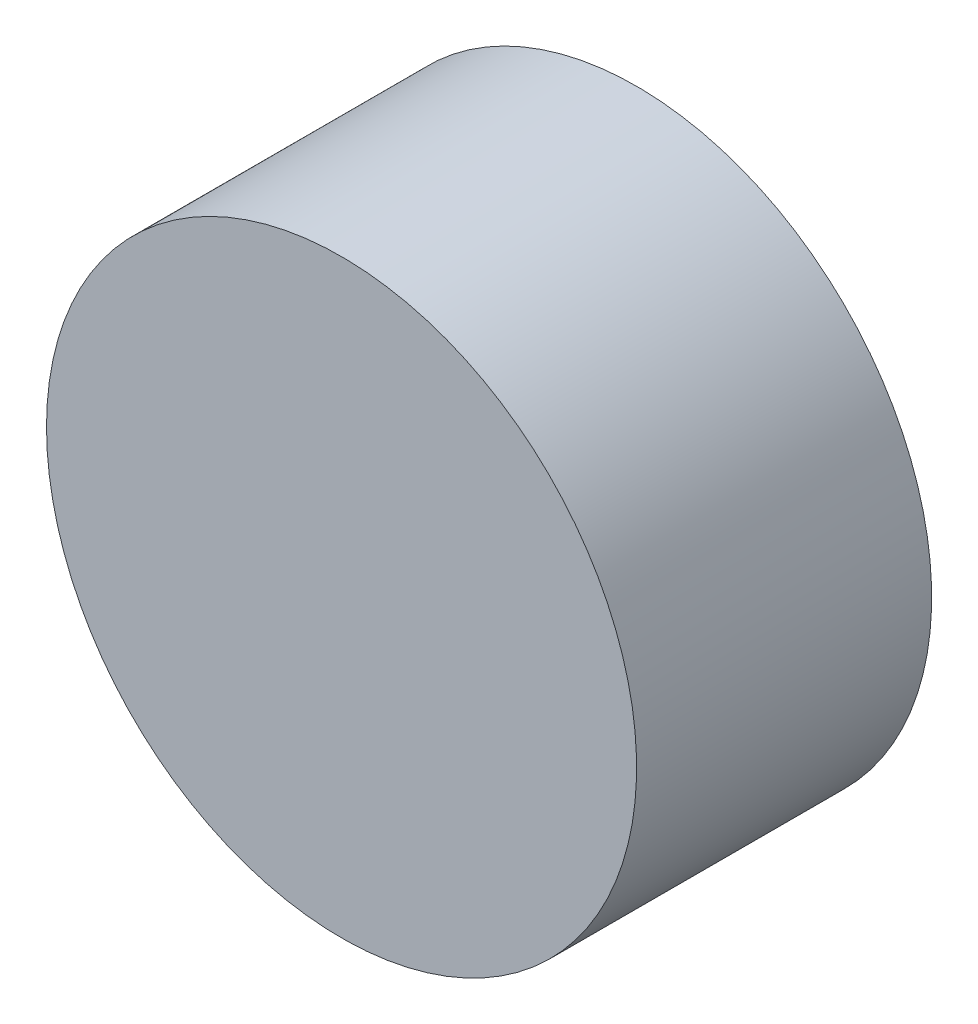
ISO-10303-21;
HEADER;
FILE_DESCRIPTION(('STEP AP214'),'2;1');
FILE_NAME('part.step','',(''),(''),'','','');
FILE_SCHEMA(('AUTOMOTIVE_DESIGN { 1 0 10303 214 1 1 1 1 }'));
ENDSEC;
DATA;
#1=APPLICATION_CONTEXT('core data for automotive mechanical design processes');
#2=APPLICATION_PROTOCOL_DEFINITION('international standard','automotive_design',2000,#1);
#3=PRODUCT_CONTEXT('',#1,'mechanical');
#4=PRODUCT('Part','Part','',(#3));
#5=PRODUCT_RELATED_PRODUCT_CATEGORY('part','',(#4));
#6=PRODUCT_DEFINITION_FORMATION('','',#4);
#7=PRODUCT_DEFINITION_CONTEXT('part definition',#1,'design');
#8=PRODUCT_DEFINITION('design','',#6,#7);
#9=PRODUCT_DEFINITION_SHAPE('','',#8);
#10=(LENGTH_UNIT() NAMED_UNIT(*) SI_UNIT(.MILLI.,.METRE.));
#11=(NAMED_UNIT(*) PLANE_ANGLE_UNIT() SI_UNIT($,.RADIAN.));
#12=(NAMED_UNIT(*) SI_UNIT($,.STERADIAN.) SOLID_ANGLE_UNIT());
#13=UNCERTAINTY_MEASURE_WITH_UNIT(LENGTH_MEASURE(1.E-05),#10,'distance_accuracy_value','');
#14=(GEOMETRIC_REPRESENTATION_CONTEXT(3) GLOBAL_UNCERTAINTY_ASSIGNED_CONTEXT((#13)) GLOBAL_UNIT_ASSIGNED_CONTEXT((#10,
#11,#12)) REPRESENTATION_CONTEXT('',''));
#15=CARTESIAN_POINT('',(0.,0.,0.));
#16=DIRECTION('',(0.,0.,1.));
#17=DIRECTION('',(1.,0.,0.));
#18=AXIS2_PLACEMENT_3D('',#15,#16,#17);
#19=CARTESIAN_POINT('',(-19.5938480051803,20.6010084166615,76.2));
#20=DIRECTION('',(0.,0.,-1.));
#21=DIRECTION('',(-1.,0.,0.));
#22=AXIS2_PLACEMENT_3D('',#19,#20,#21);
#23=CYLINDRICAL_SURFACE('',#22,76.2);
#24=CARTESIAN_POINT('',(-19.5938480051803,20.6010084166615,76.2));
#25=DIRECTION('',(0.,0.,1.));
#26=DIRECTION('',(1.,0.,0.));
#27=AXIS2_PLACEMENT_3D('',#24,#25,#26);
#28=CIRCLE('',#27,76.2);
#29=CARTESIAN_POINT('',(-95.7938480051803,20.6010084166615,76.2));
#30=VERTEX_POINT('',#29);
#31=EDGE_CURVE('E10',#30,#30,#28,.T.);
#32=CARTESIAN_POINT('',(-19.5938480051803,20.6010084166615,0.));
#33=DIRECTION('',(0.,0.,1.));
#34=DIRECTION('',(1.,0.,0.));
#35=AXIS2_PLACEMENT_3D('',#32,#33,#34);
#36=CIRCLE('',#35,76.2);
#37=CARTESIAN_POINT('',(-95.7938480051803,20.6010084166615,0.));
#38=VERTEX_POINT('',#37);
#39=EDGE_CURVE('E36',#38,#38,#36,.T.);
#40=CARTESIAN_POINT('',(-95.7938480051803,20.6010084166615,76.2));
#41=CARTESIAN_POINT('',(-95.7938480051803,20.6010084166615,75.40625));
#42=CARTESIAN_POINT('',(-95.7938480051803,20.6010084166615,74.6125));
#43=CARTESIAN_POINT('',(-95.7938480051803,20.6010084166615,73.025));
#44=CARTESIAN_POINT('',(-95.7938480051803,20.6010084166615,72.23125));
#45=CARTESIAN_POINT('',(-95.7938480051803,20.6010084166615,70.64375));
#46=CARTESIAN_POINT('',(-95.7938480051803,20.6010084166615,69.85));
#47=CARTESIAN_POINT('',(-95.7938480051803,20.6010084166615,68.2625));
#48=CARTESIAN_POINT('',(-95.7938480051803,20.6010084166615,67.46875));
#49=CARTESIAN_POINT('',(-95.7938480051803,20.6010084166615,65.88125));
#50=CARTESIAN_POINT('',(-95.7938480051803,20.6010084166615,65.0875));
#51=CARTESIAN_POINT('',(-95.7938480051803,20.6010084166615,63.5));
#52=CARTESIAN_POINT('',(-95.7938480051803,20.6010084166615,62.70625));
#53=CARTESIAN_POINT('',(-95.7938480051803,20.6010084166615,61.11875));
#54=CARTESIAN_POINT('',(-95.7938480051803,20.6010084166615,60.325));
#55=CARTESIAN_POINT('',(-95.7938480051803,20.6010084166615,58.7375));
#56=CARTESIAN_POINT('',(-95.7938480051803,20.6010084166615,57.94375));
#57=CARTESIAN_POINT('',(-95.7938480051803,20.6010084166615,56.35625));
#58=CARTESIAN_POINT('',(-95.7938480051803,20.6010084166615,55.5625));
#59=CARTESIAN_POINT('',(-95.7938480051803,20.6010084166615,53.975));
#60=CARTESIAN_POINT('',(-95.7938480051803,20.6010084166615,53.18125));
#61=CARTESIAN_POINT('',(-95.7938480051803,20.6010084166615,51.59375));
#62=CARTESIAN_POINT('',(-95.7938480051803,20.6010084166615,50.8));
#63=CARTESIAN_POINT('',(-95.7938480051803,20.6010084166615,49.2125));
#64=CARTESIAN_POINT('',(-95.7938480051803,20.6010084166615,48.41875));
#65=CARTESIAN_POINT('',(-95.7938480051803,20.6010084166615,46.83125));
#66=CARTESIAN_POINT('',(-95.7938480051803,20.6010084166615,46.0375));
#67=CARTESIAN_POINT('',(-95.7938480051803,20.6010084166615,44.45));
#68=CARTESIAN_POINT('',(-95.7938480051803,20.6010084166615,43.65625));
#69=CARTESIAN_POINT('',(-95.7938480051803,20.6010084166615,42.06875));
#70=CARTESIAN_POINT('',(-95.7938480051803,20.6010084166615,41.275));
#71=CARTESIAN_POINT('',(-95.7938480051803,20.6010084166615,39.6875));
#72=CARTESIAN_POINT('',(-95.7938480051803,20.6010084166615,38.89375));
#73=CARTESIAN_POINT('',(-95.7938480051803,20.6010084166615,37.30625));
#74=CARTESIAN_POINT('',(-95.7938480051803,20.6010084166615,36.5125));
#75=CARTESIAN_POINT('',(-95.7938480051803,20.6010084166615,34.925));
#76=CARTESIAN_POINT('',(-95.7938480051803,20.6010084166615,34.13125));
#77=CARTESIAN_POINT('',(-95.7938480051803,20.6010084166615,32.54375));
#78=CARTESIAN_POINT('',(-95.7938480051803,20.6010084166615,31.75));
#79=CARTESIAN_POINT('',(-95.7938480051803,20.6010084166615,30.1625));
#80=CARTESIAN_POINT('',(-95.7938480051803,20.6010084166615,29.36875));
#81=CARTESIAN_POINT('',(-95.7938480051803,20.6010084166615,27.78125));
#82=CARTESIAN_POINT('',(-95.7938480051803,20.6010084166615,26.9875));
#83=CARTESIAN_POINT('',(-95.7938480051803,20.6010084166615,25.4));
#84=CARTESIAN_POINT('',(-95.7938480051803,20.6010084166615,24.60625));
#85=CARTESIAN_POINT('',(-95.7938480051803,20.6010084166615,23.01875));
#86=CARTESIAN_POINT('',(-95.7938480051803,20.6010084166615,22.225));
#87=CARTESIAN_POINT('',(-95.7938480051803,20.6010084166615,20.6375));
#88=CARTESIAN_POINT('',(-95.7938480051803,20.6010084166615,19.84375));
#89=CARTESIAN_POINT('',(-95.7938480051803,20.6010084166615,18.25625));
#90=CARTESIAN_POINT('',(-95.7938480051803,20.6010084166615,17.4625));
#91=CARTESIAN_POINT('',(-95.7938480051803,20.6010084166615,15.875));
#92=CARTESIAN_POINT('',(-95.7938480051803,20.6010084166615,15.08125));
#93=CARTESIAN_POINT('',(-95.7938480051803,20.6010084166615,13.49375));
#94=CARTESIAN_POINT('',(-95.7938480051803,20.6010084166615,12.7));
#95=CARTESIAN_POINT('',(-95.7938480051803,20.6010084166615,11.1125));
#96=CARTESIAN_POINT('',(-95.7938480051803,20.6010084166615,10.31875));
#97=CARTESIAN_POINT('',(-95.7938480051803,20.6010084166615,8.73125));
#98=CARTESIAN_POINT('',(-95.7938480051803,20.6010084166615,7.93750000000001));
#99=CARTESIAN_POINT('',(-95.7938480051803,20.6010084166615,6.35));
#100=CARTESIAN_POINT('',(-95.7938480051803,20.6010084166615,5.55625));
#101=CARTESIAN_POINT('',(-95.7938480051803,20.6010084166615,3.96875));
#102=CARTESIAN_POINT('',(-95.7938480051803,20.6010084166615,3.175));
#103=CARTESIAN_POINT('',(-95.7938480051803,20.6010084166615,1.5875));
#104=CARTESIAN_POINT('',(-95.7938480051803,20.6010084166615,0.793750000000001));
#105=CARTESIAN_POINT('',(-95.7938480051803,20.6010084166615,0.));
#106=B_SPLINE_CURVE_WITH_KNOTS('',3,(#40,#41,#42,#43,#44,#45,#46,#47,#48,#49,#50,#51,#52,#53,
#54,#55,#56,#57,#58,#59,#60,#61,#62,#63,#64,#65,#66,#67,#68,#69,#70,#71,#72,#73,#74,#75,#76,#77,
#78,#79,#80,#81,#82,#83,#84,#85,#86,#87,#88,#89,#90,#91,#92,#93,#94,#95,#96,#97,#98,#99,#100,
#101,#102,#103,#104,#105),.UNSPECIFIED.,.F.,.F.,(4,2,2,2,2,2,2,2,2,2,2,2,2,2,2,2,2,2,2,2,2,2,2,
2,2,2,2,2,2,2,2,2,4),(0.,2.38125,4.7625,7.14375,9.52500000000001,11.90625,14.2875,16.66875,
19.05,21.43125,23.8125,26.19375,28.575,30.95625,33.3375,35.71875,38.1,40.48125,42.8625,45.24375,
47.625,50.00625,52.3875,54.76875,57.15,59.53125,61.9125,64.29375,66.675,69.05625,71.4375,
73.81875,76.2),.UNSPECIFIED.);
#107=EDGE_CURVE('BSEAM33',#30,#38,#106,.T.);
#108=ORIENTED_EDGE('',*,*,#31,.F.);
#109=ORIENTED_EDGE('',*,*,#39,.T.);
#110=ORIENTED_EDGE('',*,*,#107,.T.);
#111=ORIENTED_EDGE('',*,*,#107,.F.);
#112=EDGE_LOOP('',(#108,#110,#109,#111));
#113=FACE_BOUND('',#112,.T.);
#114=ADVANCED_FACE('F33',(#113),#23,.T.);
#115=CARTESIAN_POINT('',(-19.5938480051803,20.6010084166615,76.2));
#116=DIRECTION('',(0.,0.,1.));
#117=DIRECTION('',(1.,0.,0.));
#118=AXIS2_PLACEMENT_3D('',#115,#116,#117);
#119=PLANE('',#118);
#120=ORIENTED_EDGE('',*,*,#31,.T.);
#121=EDGE_LOOP('',(#120));
#122=FACE_BOUND('',#121,.T.);
#123=ADVANCED_FACE('F48',(#122),#119,.T.);
#124=CARTESIAN_POINT('',(-19.5938480051803,20.6010084166615,0.));
#125=DIRECTION('',(0.,0.,1.));
#126=DIRECTION('',(1.,0.,0.));
#127=AXIS2_PLACEMENT_3D('',#124,#125,#126);
#128=PLANE('',#127);
#129=ORIENTED_EDGE('',*,*,#39,.F.);
#130=EDGE_LOOP('',(#129));
#131=FACE_BOUND('',#130,.T.);
#132=ADVANCED_FACE('F46',(#131),#128,.F.);
#133=CLOSED_SHELL('',(#114,#123,#132));
#134=MANIFOLD_SOLID_BREP('B2',#133);
#135=ADVANCED_BREP_SHAPE_REPRESENTATION('',(#18,#134),#14);
#136=SHAPE_DEFINITION_REPRESENTATION(#9,#135);
ENDSEC;
END-ISO-10303-21;
